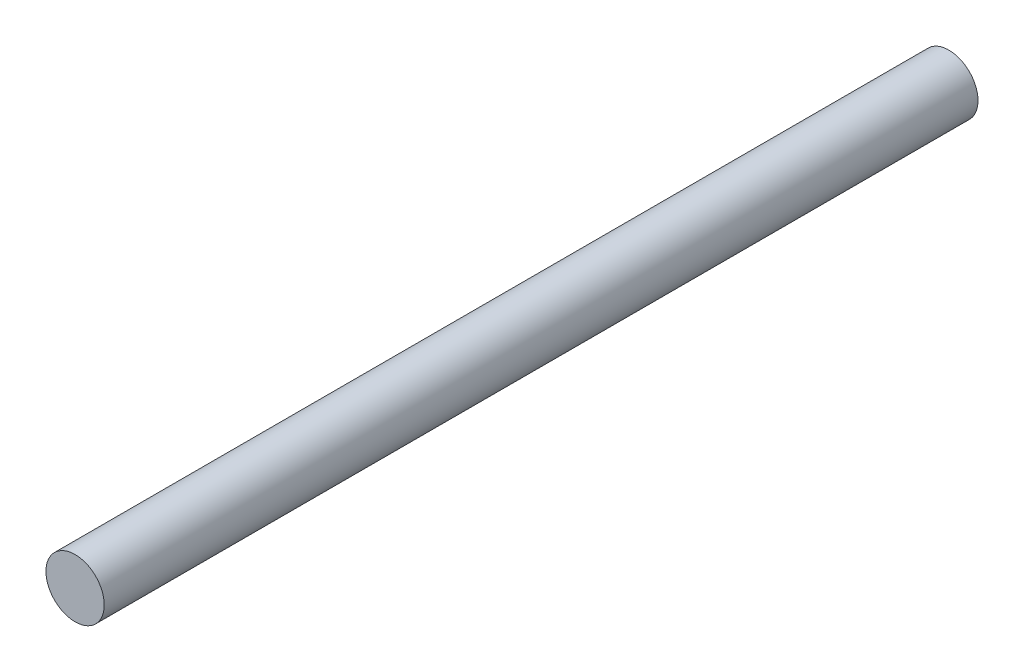
ISO-10303-21;
HEADER;
FILE_DESCRIPTION(('STEP AP214'),'2;1');
FILE_NAME('part.step','',(''),(''),'','','');
FILE_SCHEMA(('AUTOMOTIVE_DESIGN { 1 0 10303 214 1 1 1 1 }'));
ENDSEC;
DATA;
#1=APPLICATION_CONTEXT('core data for automotive mechanical design processes');
#2=APPLICATION_PROTOCOL_DEFINITION('international standard','automotive_design',2000,#1);
#3=PRODUCT_CONTEXT('',#1,'mechanical');
#4=PRODUCT('Part','Part','',(#3));
#5=PRODUCT_RELATED_PRODUCT_CATEGORY('part','',(#4));
#6=PRODUCT_DEFINITION_FORMATION('','',#4);
#7=PRODUCT_DEFINITION_CONTEXT('part definition',#1,'design');
#8=PRODUCT_DEFINITION('design','',#6,#7);
#9=PRODUCT_DEFINITION_SHAPE('','',#8);
#10=(LENGTH_UNIT() NAMED_UNIT(*) SI_UNIT(.MILLI.,.METRE.));
#11=(NAMED_UNIT(*) PLANE_ANGLE_UNIT() SI_UNIT($,.RADIAN.));
#12=(NAMED_UNIT(*) SI_UNIT($,.STERADIAN.) SOLID_ANGLE_UNIT());
#13=UNCERTAINTY_MEASURE_WITH_UNIT(LENGTH_MEASURE(1.E-05),#10,'distance_accuracy_value','');
#14=(GEOMETRIC_REPRESENTATION_CONTEXT(3) GLOBAL_UNCERTAINTY_ASSIGNED_CONTEXT((#13)) GLOBAL_UNIT_ASSIGNED_CONTEXT((#10,
#11,#12)) REPRESENTATION_CONTEXT('',''));
#15=CARTESIAN_POINT('',(0.,0.,0.));
#16=DIRECTION('',(0.,0.,1.));
#17=DIRECTION('',(1.,0.,0.));
#18=AXIS2_PLACEMENT_3D('',#15,#16,#17);
#19=CARTESIAN_POINT('',(0.,0.,47.57));
#20=DIRECTION('',(0.,0.,-1.));
#21=DIRECTION('',(-1.,0.,0.));
#22=AXIS2_PLACEMENT_3D('',#19,#20,#21);
#23=CYLINDRICAL_SURFACE('',#22,1.5875);
#24=CARTESIAN_POINT('',(0.,0.,47.57));
#25=DIRECTION('',(0.,0.,1.));
#26=DIRECTION('',(1.,0.,0.));
#27=AXIS2_PLACEMENT_3D('',#24,#25,#26);
#28=CIRCLE('',#27,1.5875);
#29=CARTESIAN_POINT('',(1.5875,0.,47.57));
#30=VERTEX_POINT('',#29);
#31=EDGE_CURVE('E10',#30,#30,#28,.T.);
#32=ORIENTED_EDGE('',*,*,#31,.F.);
#33=EDGE_LOOP('',(#32));
#34=FACE_BOUND('',#33,.T.);
#35=CARTESIAN_POINT('',(0.,0.,0.));
#36=DIRECTION('',(0.,0.,1.));
#37=DIRECTION('',(1.,0.,0.));
#38=AXIS2_PLACEMENT_3D('',#35,#36,#37);
#39=CIRCLE('',#38,1.5875);
#40=CARTESIAN_POINT('',(1.5875,0.,0.));
#41=VERTEX_POINT('',#40);
#42=EDGE_CURVE('E34',#41,#41,#39,.T.);
#43=ORIENTED_EDGE('',*,*,#42,.T.);
#44=EDGE_LOOP('',(#43));
#45=FACE_BOUND('',#44,.T.);
#46=ADVANCED_FACE('F31',(#34,#45),#23,.T.);
#47=CARTESIAN_POINT('',(0.,0.,47.57));
#48=DIRECTION('',(0.,0.,1.));
#49=DIRECTION('',(1.,0.,0.));
#50=AXIS2_PLACEMENT_3D('',#47,#48,#49);
#51=PLANE('',#50);
#52=ORIENTED_EDGE('',*,*,#31,.T.);
#53=EDGE_LOOP('',(#52));
#54=FACE_BOUND('',#53,.T.);
#55=ADVANCED_FACE('F46',(#54),#51,.T.);
#56=CARTESIAN_POINT('',(0.,0.,0.));
#57=DIRECTION('',(0.,0.,1.));
#58=DIRECTION('',(1.,0.,0.));
#59=AXIS2_PLACEMENT_3D('',#56,#57,#58);
#60=PLANE('',#59);
#61=ORIENTED_EDGE('',*,*,#42,.F.);
#62=EDGE_LOOP('',(#61));
#63=FACE_BOUND('',#62,.T.);
#64=ADVANCED_FACE('F44',(#63),#60,.F.);
#65=CLOSED_SHELL('',(#46,#55,#64));
#66=MANIFOLD_SOLID_BREP('B2',#65);
#67=ADVANCED_BREP_SHAPE_REPRESENTATION('',(#18,#66),#14);
#68=SHAPE_DEFINITION_REPRESENTATION(#9,#67);
ENDSEC;
END-ISO-10303-21;
